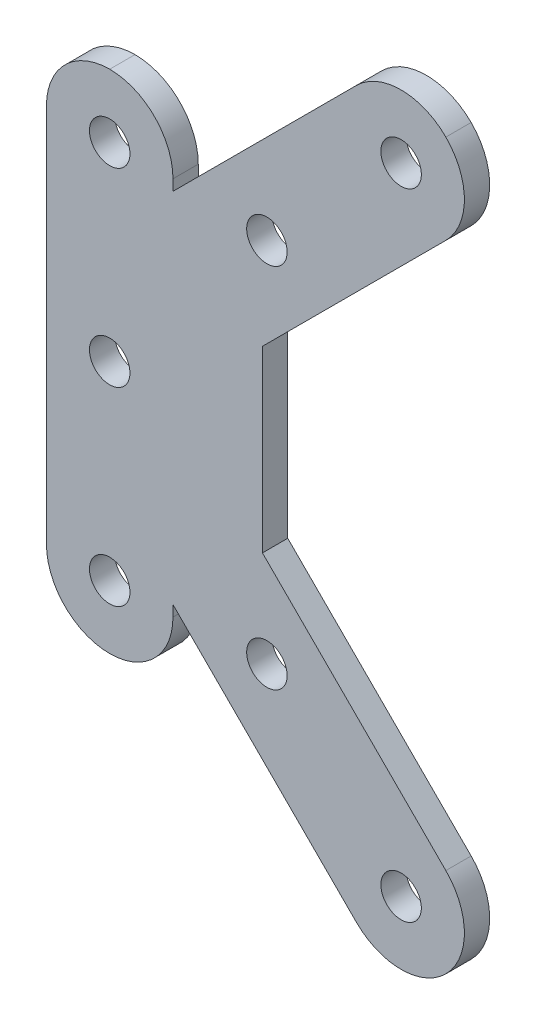
ISO-10303-21;
HEADER;
FILE_DESCRIPTION(('STEP AP214'),'2;1');
FILE_NAME('part.step','',(''),(''),'','','');
FILE_SCHEMA(('AUTOMOTIVE_DESIGN { 1 0 10303 214 1 1 1 1 }'));
ENDSEC;
DATA;
#1=APPLICATION_CONTEXT('core data for automotive mechanical design processes');
#2=APPLICATION_PROTOCOL_DEFINITION('international standard','automotive_design',2000,#1);
#3=PRODUCT_CONTEXT('',#1,'mechanical');
#4=PRODUCT('Part','Part','',(#3));
#5=PRODUCT_RELATED_PRODUCT_CATEGORY('part','',(#4));
#6=PRODUCT_DEFINITION_FORMATION('','',#4);
#7=PRODUCT_DEFINITION_CONTEXT('part definition',#1,'design');
#8=PRODUCT_DEFINITION('design','',#6,#7);
#9=PRODUCT_DEFINITION_SHAPE('','',#8);
#10=(LENGTH_UNIT() NAMED_UNIT(*) SI_UNIT(.MILLI.,.METRE.));
#11=(NAMED_UNIT(*) PLANE_ANGLE_UNIT() SI_UNIT($,.RADIAN.));
#12=(NAMED_UNIT(*) SI_UNIT($,.STERADIAN.) SOLID_ANGLE_UNIT());
#13=UNCERTAINTY_MEASURE_WITH_UNIT(LENGTH_MEASURE(1.E-05),#10,'distance_accuracy_value','');
#14=(GEOMETRIC_REPRESENTATION_CONTEXT(3) GLOBAL_UNCERTAINTY_ASSIGNED_CONTEXT((#13)) GLOBAL_UNIT_ASSIGNED_CONTEXT((#10,
#11,#12)) REPRESENTATION_CONTEXT('',''));
#15=CARTESIAN_POINT('',(0.,0.,0.));
#16=DIRECTION('',(0.,0.,1.));
#17=DIRECTION('',(1.,0.,0.));
#18=AXIS2_PLACEMENT_3D('',#15,#16,#17);
#19=CARTESIAN_POINT('',(0.,0.,1.));
#20=DIRECTION('',(0.,0.,1.));
#21=DIRECTION('',(1.,0.,0.));
#22=AXIS2_PLACEMENT_3D('',#19,#20,#21);
#23=PLANE('',#22);
#24=CARTESIAN_POINT('',(12.4246212024587,-14.4956890143242,1.));
#25=DIRECTION('',(0.,0.,-1.));
#26=DIRECTION('',(-1.,0.,0.));
#27=AXIS2_PLACEMENT_3D('',#24,#25,#26);
#28=CIRCLE('',#27,1.6);
#29=CARTESIAN_POINT('',(10.8246212024587,-14.4956890143242,1.));
#30=VERTEX_POINT('',#29);
#31=EDGE_CURVE('E730',#30,#30,#28,.T.);
#32=ORIENTED_EDGE('',*,*,#31,.T.);
#33=EDGE_LOOP('',(#32));
#34=FACE_BOUND('',#33,.T.);
#35=CARTESIAN_POINT('',(23.031222920257,25.1022907321224,1.));
#36=DIRECTION('',(0.,0.,1.));
#37=DIRECTION('',(1.,0.,0.));
#38=AXIS2_PLACEMENT_3D('',#35,#36,#37);
#39=CIRCLE('',#38,1.6);
#40=CARTESIAN_POINT('',(24.631222920257,25.1022907321224,1.));
#41=VERTEX_POINT('',#40);
#42=EDGE_CURVE('E715',#41,#41,#39,.T.);
#43=ORIENTED_EDGE('',*,*,#42,.F.);
#44=EDGE_LOOP('',(#43));
#45=FACE_BOUND('',#44,.T.);
#46=CARTESIAN_POINT('',(12.4246212024587,14.4956890143242,1.));
#47=DIRECTION('',(0.,0.,1.));
#48=DIRECTION('',(1.,0.,0.));
#49=AXIS2_PLACEMENT_3D('',#46,#47,#48);
#50=CIRCLE('',#49,1.6);
#51=CARTESIAN_POINT('',(14.0246212024587,14.4956890143242,1.));
#52=VERTEX_POINT('',#51);
#53=EDGE_CURVE('E711',#52,#52,#50,.T.);
#54=ORIENTED_EDGE('',*,*,#53,.F.);
#55=EDGE_LOOP('',(#54));
#56=FACE_BOUND('',#55,.T.);
#57=CARTESIAN_POINT('',(0.,-15.,1.));
#58=DIRECTION('',(0.,0.,1.));
#59=DIRECTION('',(1.,0.,0.));
#60=AXIS2_PLACEMENT_3D('',#57,#58,#59);
#61=CIRCLE('',#60,5.);
#62=CARTESIAN_POINT('',(-5.,-15.,1.));
#63=VERTEX_POINT('',#62);
#64=CARTESIAN_POINT('',(0.,-20.,1.));
#65=VERTEX_POINT('',#64);
#66=EDGE_CURVE('E327',#63,#65,#61,.T.);
#67=ORIENTED_EDGE('',*,*,#66,.T.);
#68=CARTESIAN_POINT('',(0.,-15.,1.));
#69=DIRECTION('',(0.,0.,1.));
#70=DIRECTION('',(1.,0.,0.));
#71=AXIS2_PLACEMENT_3D('',#68,#69,#70);
#72=CIRCLE('',#71,5.);
#73=CARTESIAN_POINT('',(5.,-15.,1.));
#74=VERTEX_POINT('',#73);
#75=EDGE_CURVE('E330',#65,#74,#72,.T.);
#76=ORIENTED_EDGE('',*,*,#75,.T.);
#77=DIRECTION('',(0.,1.,0.));
#78=VECTOR('',#77,1.);
#79=CARTESIAN_POINT('',(5.,-20.,1.));
#80=LINE('',#79,#78);
#81=CARTESIAN_POINT('',(5.,-14.1421356237309,1.));
#82=VERTEX_POINT('',#81);
#83=EDGE_CURVE('E264',#74,#82,#80,.T.);
#84=ORIENTED_EDGE('',*,*,#83,.T.);
#85=DIRECTION('',(-0.707106781186556,0.707106781186539,0.));
#86=VECTOR('',#85,1.);
#87=CARTESIAN_POINT('',(-4.57106781186554,-4.57106781186564,1.));
#88=LINE('',#87,#86);
#89=CARTESIAN_POINT('',(19.4956890143244,-28.637824638055,1.));
#90=VERTEX_POINT('',#89);
#91=EDGE_CURVE('E246',#90,#82,#88,.T.);
#92=ORIENTED_EDGE('',*,*,#91,.F.);
#93=CARTESIAN_POINT('',(23.0312229202571,-25.1022907321222,1.));
#94=DIRECTION('',(0.,0.,1.));
#95=DIRECTION('',(1.,0.,0.));
#96=AXIS2_PLACEMENT_3D('',#93,#94,#95);
#97=CIRCLE('',#96,5.);
#98=CARTESIAN_POINT('',(26.5667568261899,-28.6378246380549,1.));
#99=VERTEX_POINT('',#98);
#100=EDGE_CURVE('E324',#90,#99,#97,.T.);
#101=ORIENTED_EDGE('',*,*,#100,.T.);
#102=CARTESIAN_POINT('',(23.0312229202571,-25.1022907321222,1.));
#103=DIRECTION('',(0.,0.,1.));
#104=DIRECTION('',(1.,0.,0.));
#105=AXIS2_PLACEMENT_3D('',#102,#103,#104);
#106=CIRCLE('',#105,5.);
#107=CARTESIAN_POINT('',(26.5667568261898,-21.5667568261895,1.));
#108=VERTEX_POINT('',#107);
#109=EDGE_CURVE('E321',#99,#108,#106,.T.);
#110=ORIENTED_EDGE('',*,*,#109,.T.);
#111=DIRECTION('',(0.707106781186554,-0.707106781186542,0.));
#112=VECTOR('',#111,1.);
#113=CARTESIAN_POINT('',(2.49999999999996,2.5,1.));
#114=LINE('',#113,#112);
#115=CARTESIAN_POINT('',(12.0710678118654,-7.07106781186533,1.));
#116=VERTEX_POINT('',#115);
#117=EDGE_CURVE('E704',#116,#108,#114,.T.);
#118=ORIENTED_EDGE('',*,*,#117,.F.);
#119=DIRECTION('',(0.,-1.,0.));
#120=VECTOR('',#119,1.);
#121=CARTESIAN_POINT('',(12.0710678118655,0.,1.));
#122=LINE('',#121,#120);
#123=CARTESIAN_POINT('',(12.0710678118655,7.07106781186543,1.));
#124=VERTEX_POINT('',#123);
#125=EDGE_CURVE('E700',#124,#116,#122,.T.);
#126=ORIENTED_EDGE('',*,*,#125,.F.);
#127=DIRECTION('',(0.707106781186553,0.707106781186542,0.));
#128=VECTOR('',#127,1.);
#129=CARTESIAN_POINT('',(2.49999999999996,-2.5,1.));
#130=LINE('',#129,#128);
#131=CARTESIAN_POINT('',(26.5667568261898,21.5667568261895,1.));
#132=VERTEX_POINT('',#131);
#133=EDGE_CURVE('E684',#124,#132,#130,.T.);
#134=ORIENTED_EDGE('',*,*,#133,.T.);
#135=CARTESIAN_POINT('',(23.0312229202571,25.1022907321222,1.));
#136=DIRECTION('',(0.,0.,1.));
#137=DIRECTION('',(1.,0.,0.));
#138=AXIS2_PLACEMENT_3D('',#135,#136,#137);
#139=CIRCLE('',#138,5.);
#140=CARTESIAN_POINT('',(26.5667568261898,28.6378246380549,1.));
#141=VERTEX_POINT('',#140);
#142=EDGE_CURVE('E140',#132,#141,#139,.T.);
#143=ORIENTED_EDGE('',*,*,#142,.T.);
#144=CARTESIAN_POINT('',(23.0312229202571,25.1022907321222,1.));
#145=DIRECTION('',(0.,0.,1.));
#146=DIRECTION('',(1.,0.,0.));
#147=AXIS2_PLACEMENT_3D('',#144,#145,#146);
#148=CIRCLE('',#147,5.);
#149=CARTESIAN_POINT('',(19.4956890143244,28.637824638055,1.));
#150=VERTEX_POINT('',#149);
#151=EDGE_CURVE('E242',#141,#150,#148,.T.);
#152=ORIENTED_EDGE('',*,*,#151,.T.);
#153=DIRECTION('',(-0.707106781186555,-0.70710678118654,0.));
#154=VECTOR('',#153,1.);
#155=CARTESIAN_POINT('',(-4.57106781186552,4.57106781186561,1.));
#156=LINE('',#155,#154);
#157=CARTESIAN_POINT('',(5.,14.1421356237309,1.));
#158=VERTEX_POINT('',#157);
#159=EDGE_CURVE('E237',#150,#158,#156,.T.);
#160=ORIENTED_EDGE('',*,*,#159,.T.);
#161=CARTESIAN_POINT('',(5.,15.,1.));
#162=VERTEX_POINT('',#161);
#163=EDGE_CURVE('E241',#158,#162,#80,.T.);
#164=ORIENTED_EDGE('',*,*,#163,.T.);
#165=CARTESIAN_POINT('',(0.,15.,1.));
#166=DIRECTION('',(0.,0.,1.));
#167=DIRECTION('',(1.,0.,0.));
#168=AXIS2_PLACEMENT_3D('',#165,#166,#167);
#169=CIRCLE('',#168,5.);
#170=CARTESIAN_POINT('',(0.,20.,1.));
#171=VERTEX_POINT('',#170);
#172=EDGE_CURVE('E314',#162,#171,#169,.T.);
#173=ORIENTED_EDGE('',*,*,#172,.T.);
#174=CARTESIAN_POINT('',(0.,15.,1.));
#175=DIRECTION('',(0.,0.,1.));
#176=DIRECTION('',(1.,0.,0.));
#177=AXIS2_PLACEMENT_3D('',#174,#175,#176);
#178=CIRCLE('',#177,5.);
#179=CARTESIAN_POINT('',(-5.,15.,1.));
#180=VERTEX_POINT('',#179);
#181=EDGE_CURVE('E311',#171,#180,#178,.T.);
#182=ORIENTED_EDGE('',*,*,#181,.T.);
#183=DIRECTION('',(0.,-1.,0.));
#184=VECTOR('',#183,1.);
#185=CARTESIAN_POINT('',(-5.,20.,1.));
#186=LINE('',#185,#184);
#187=EDGE_CURVE('E265',#180,#63,#186,.T.);
#188=ORIENTED_EDGE('',*,*,#187,.T.);
#189=EDGE_LOOP('',(#67,#76,#84,#92,#101,#110,#118,#126,#134,#143,#152,#160,#164,#173,#182,#188));
#190=FACE_BOUND('',#189,.T.);
#191=CARTESIAN_POINT('',(0.,0.,1.));
#192=DIRECTION('',(0.,0.,1.));
#193=DIRECTION('',(1.,0.,0.));
#194=AXIS2_PLACEMENT_3D('',#191,#192,#193);
#195=CIRCLE('',#194,1.6);
#196=CARTESIAN_POINT('',(1.6,0.,1.));
#197=VERTEX_POINT('',#196);
#198=EDGE_CURVE('E420',#197,#197,#195,.T.);
#199=ORIENTED_EDGE('',*,*,#198,.F.);
#200=EDGE_LOOP('',(#199));
#201=FACE_BOUND('',#200,.T.);
#202=CARTESIAN_POINT('',(0.,15.,1.));
#203=DIRECTION('',(0.,0.,1.));
#204=DIRECTION('',(1.,0.,0.));
#205=AXIS2_PLACEMENT_3D('',#202,#203,#204);
#206=CIRCLE('',#205,1.6);
#207=CARTESIAN_POINT('',(1.59999999999995,15.,1.));
#208=VERTEX_POINT('',#207);
#209=EDGE_CURVE('E280',#208,#208,#206,.T.);
#210=ORIENTED_EDGE('',*,*,#209,.F.);
#211=EDGE_LOOP('',(#210));
#212=FACE_BOUND('',#211,.T.);
#213=CARTESIAN_POINT('',(1.5619817514858E-13,-15.,1.));
#214=DIRECTION('',(0.,0.,1.));
#215=DIRECTION('',(1.,0.,0.));
#216=AXIS2_PLACEMENT_3D('',#213,#214,#215);
#217=CIRCLE('',#216,1.6);
#218=CARTESIAN_POINT('',(1.60000000000016,-15.,1.));
#219=VERTEX_POINT('',#218);
#220=EDGE_CURVE('E410',#219,#219,#217,.T.);
#221=ORIENTED_EDGE('',*,*,#220,.F.);
#222=EDGE_LOOP('',(#221));
#223=FACE_BOUND('',#222,.T.);
#224=CARTESIAN_POINT('',(23.031222920257,-25.1022907321224,1.));
#225=DIRECTION('',(0.,0.,-1.));
#226=DIRECTION('',(-1.,0.,0.));
#227=AXIS2_PLACEMENT_3D('',#224,#225,#226);
#228=CIRCLE('',#227,1.6);
#229=CARTESIAN_POINT('',(21.4312229202569,-25.1022907321224,1.));
#230=VERTEX_POINT('',#229);
#231=EDGE_CURVE('E722',#230,#230,#228,.T.);
#232=ORIENTED_EDGE('',*,*,#231,.T.);
#233=EDGE_LOOP('',(#232));
#234=FACE_BOUND('',#233,.T.);
#235=ADVANCED_FACE('F122',(#34,#45,#56,#190,#201,#212,#223,#234),#23,.T.);
#236=CARTESIAN_POINT('',(0.,0.,-1.));
#237=DIRECTION('',(0.,0.,1.));
#238=DIRECTION('',(1.,0.,0.));
#239=AXIS2_PLACEMENT_3D('',#236,#237,#238);
#240=PLANE('',#239);
#241=CARTESIAN_POINT('',(23.031222920257,25.1022907321224,-1.));
#242=DIRECTION('',(0.,0.,1.));
#243=DIRECTION('',(1.,0.,0.));
#244=AXIS2_PLACEMENT_3D('',#241,#242,#243);
#245=CIRCLE('',#244,1.6);
#246=CARTESIAN_POINT('',(24.631222920257,25.1022907321224,-1.));
#247=VERTEX_POINT('',#246);
#248=EDGE_CURVE('E733',#247,#247,#245,.T.);
#249=ORIENTED_EDGE('',*,*,#248,.T.);
#250=EDGE_LOOP('',(#249));
#251=FACE_BOUND('',#250,.T.);
#252=CARTESIAN_POINT('',(12.4246212024587,14.4956890143242,-1.));
#253=DIRECTION('',(0.,0.,1.));
#254=DIRECTION('',(1.,0.,0.));
#255=AXIS2_PLACEMENT_3D('',#252,#253,#254);
#256=CIRCLE('',#255,1.6);
#257=CARTESIAN_POINT('',(14.0246212024587,14.4956890143242,-1.));
#258=VERTEX_POINT('',#257);
#259=EDGE_CURVE('E419',#258,#258,#256,.T.);
#260=ORIENTED_EDGE('',*,*,#259,.T.);
#261=EDGE_LOOP('',(#260));
#262=FACE_BOUND('',#261,.T.);
#263=DIRECTION('',(0.,1.,0.));
#264=VECTOR('',#263,1.);
#265=CARTESIAN_POINT('',(5.,-20.,-1.));
#266=LINE('',#265,#264);
#267=CARTESIAN_POINT('',(5.,-15.,-1.));
#268=VERTEX_POINT('',#267);
#269=CARTESIAN_POINT('',(5.,-14.1421356237309,-1.));
#270=VERTEX_POINT('',#269);
#271=EDGE_CURVE('E271',#268,#270,#266,.T.);
#272=ORIENTED_EDGE('',*,*,#271,.F.);
#273=CARTESIAN_POINT('',(0.,-15.,-1.));
#274=DIRECTION('',(0.,0.,1.));
#275=DIRECTION('',(1.,0.,0.));
#276=AXIS2_PLACEMENT_3D('',#273,#274,#275);
#277=CIRCLE('',#276,5.);
#278=CARTESIAN_POINT('',(0.,-20.,-1.));
#279=VERTEX_POINT('',#278);
#280=EDGE_CURVE('E308',#268,#279,#277,.F.);
#281=ORIENTED_EDGE('',*,*,#280,.T.);
#282=CARTESIAN_POINT('',(0.,-15.,-1.));
#283=DIRECTION('',(0.,0.,1.));
#284=DIRECTION('',(1.,0.,0.));
#285=AXIS2_PLACEMENT_3D('',#282,#283,#284);
#286=CIRCLE('',#285,5.);
#287=CARTESIAN_POINT('',(-5.,-15.,-1.));
#288=VERTEX_POINT('',#287);
#289=EDGE_CURVE('E305',#279,#288,#286,.F.);
#290=ORIENTED_EDGE('',*,*,#289,.T.);
#291=DIRECTION('',(0.,-1.,0.));
#292=VECTOR('',#291,1.);
#293=CARTESIAN_POINT('',(-5.,20.,-1.));
#294=LINE('',#293,#292);
#295=CARTESIAN_POINT('',(-5.,15.,-1.));
#296=VERTEX_POINT('',#295);
#297=EDGE_CURVE('E275',#296,#288,#294,.T.);
#298=ORIENTED_EDGE('',*,*,#297,.F.);
#299=CARTESIAN_POINT('',(0.,15.,-1.));
#300=DIRECTION('',(0.,0.,1.));
#301=DIRECTION('',(1.,0.,0.));
#302=AXIS2_PLACEMENT_3D('',#299,#300,#301);
#303=CIRCLE('',#302,5.);
#304=CARTESIAN_POINT('',(0.,20.,-1.));
#305=VERTEX_POINT('',#304);
#306=EDGE_CURVE('E287',#296,#305,#303,.F.);
#307=ORIENTED_EDGE('',*,*,#306,.T.);
#308=CARTESIAN_POINT('',(0.,15.,-1.));
#309=DIRECTION('',(0.,0.,1.));
#310=DIRECTION('',(1.,0.,0.));
#311=AXIS2_PLACEMENT_3D('',#308,#309,#310);
#312=CIRCLE('',#311,5.);
#313=CARTESIAN_POINT('',(5.,15.,-1.));
#314=VERTEX_POINT('',#313);
#315=EDGE_CURVE('E290',#305,#314,#312,.F.);
#316=ORIENTED_EDGE('',*,*,#315,.T.);
#317=CARTESIAN_POINT('',(5.,14.1421356237309,-1.));
#318=VERTEX_POINT('',#317);
#319=EDGE_CURVE('E279',#318,#314,#266,.T.);
#320=ORIENTED_EDGE('',*,*,#319,.F.);
#321=DIRECTION('',(-0.707106781186555,-0.70710678118654,0.));
#322=VECTOR('',#321,1.);
#323=CARTESIAN_POINT('',(-4.57106781186552,4.57106781186561,-1.));
#324=LINE('',#323,#322);
#325=CARTESIAN_POINT('',(19.4956890143244,28.637824638055,-1.));
#326=VERTEX_POINT('',#325);
#327=EDGE_CURVE('E253',#326,#318,#324,.T.);
#328=ORIENTED_EDGE('',*,*,#327,.F.);
#329=CARTESIAN_POINT('',(23.0312229202571,25.1022907321222,-1.));
#330=DIRECTION('',(0.,0.,1.));
#331=DIRECTION('',(1.,0.,0.));
#332=AXIS2_PLACEMENT_3D('',#329,#330,#331);
#333=CIRCLE('',#332,5.);
#334=CARTESIAN_POINT('',(26.5667568261898,28.6378246380549,-1.));
#335=VERTEX_POINT('',#334);
#336=EDGE_CURVE('E293',#326,#335,#333,.F.);
#337=ORIENTED_EDGE('',*,*,#336,.T.);
#338=CARTESIAN_POINT('',(23.0312229202571,25.1022907321222,-1.));
#339=DIRECTION('',(0.,0.,1.));
#340=DIRECTION('',(1.,0.,0.));
#341=AXIS2_PLACEMENT_3D('',#338,#339,#340);
#342=CIRCLE('',#341,5.);
#343=CARTESIAN_POINT('',(26.5667568261898,21.5667568261895,-1.));
#344=VERTEX_POINT('',#343);
#345=EDGE_CURVE('E296',#335,#344,#342,.F.);
#346=ORIENTED_EDGE('',*,*,#345,.T.);
#347=DIRECTION('',(0.707106781186553,0.707106781186542,0.));
#348=VECTOR('',#347,1.);
#349=CARTESIAN_POINT('',(2.49999999999996,-2.5,-1.));
#350=LINE('',#349,#348);
#351=CARTESIAN_POINT('',(12.0710678118655,7.07106781186543,-1.));
#352=VERTEX_POINT('',#351);
#353=EDGE_CURVE('E247',#352,#344,#350,.T.);
#354=ORIENTED_EDGE('',*,*,#353,.F.);
#355=DIRECTION('',(0.,-1.,0.));
#356=VECTOR('',#355,1.);
#357=CARTESIAN_POINT('',(12.0710678118655,0.,-1.));
#358=LINE('',#357,#356);
#359=CARTESIAN_POINT('',(12.0710678118654,-7.07106781186533,-1.));
#360=VERTEX_POINT('',#359);
#361=EDGE_CURVE('E690',#352,#360,#358,.T.);
#362=ORIENTED_EDGE('',*,*,#361,.T.);
#363=DIRECTION('',(0.707106781186554,-0.707106781186542,0.));
#364=VECTOR('',#363,1.);
#365=CARTESIAN_POINT('',(2.49999999999996,2.5,-1.));
#366=LINE('',#365,#364);
#367=CARTESIAN_POINT('',(26.5667568261898,-21.5667568261895,-1.));
#368=VERTEX_POINT('',#367);
#369=EDGE_CURVE('E681',#360,#368,#366,.T.);
#370=ORIENTED_EDGE('',*,*,#369,.T.);
#371=CARTESIAN_POINT('',(23.0312229202571,-25.1022907321222,-1.));
#372=DIRECTION('',(0.,0.,1.));
#373=DIRECTION('',(1.,0.,0.));
#374=AXIS2_PLACEMENT_3D('',#371,#372,#373);
#375=CIRCLE('',#374,5.);
#376=CARTESIAN_POINT('',(26.5667568261899,-28.6378246380549,-1.));
#377=VERTEX_POINT('',#376);
#378=EDGE_CURVE('E299',#368,#377,#375,.F.);
#379=ORIENTED_EDGE('',*,*,#378,.T.);
#380=CARTESIAN_POINT('',(23.0312229202571,-25.1022907321222,-1.));
#381=DIRECTION('',(0.,0.,1.));
#382=DIRECTION('',(1.,0.,0.));
#383=AXIS2_PLACEMENT_3D('',#380,#381,#382);
#384=CIRCLE('',#383,5.);
#385=CARTESIAN_POINT('',(19.4956890143244,-28.637824638055,-1.));
#386=VERTEX_POINT('',#385);
#387=EDGE_CURVE('E302',#377,#386,#384,.F.);
#388=ORIENTED_EDGE('',*,*,#387,.T.);
#389=DIRECTION('',(-0.707106781186556,0.707106781186539,0.));
#390=VECTOR('',#389,1.);
#391=CARTESIAN_POINT('',(-4.57106781186554,-4.57106781186564,-1.));
#392=LINE('',#391,#390);
#393=EDGE_CURVE('E398',#386,#270,#392,.T.);
#394=ORIENTED_EDGE('',*,*,#393,.T.);
#395=EDGE_LOOP('',(#272,#281,#290,#298,#307,#316,#320,#328,#337,#346,#354,#362,#370,#379,#388,#394));
#396=FACE_BOUND('',#395,.T.);
#397=CARTESIAN_POINT('',(0.,15.,-1.));
#398=DIRECTION('',(0.,0.,1.));
#399=DIRECTION('',(1.,0.,0.));
#400=AXIS2_PLACEMENT_3D('',#397,#398,#399);
#401=CIRCLE('',#400,1.6);
#402=CARTESIAN_POINT('',(1.59999999999995,15.,-1.));
#403=VERTEX_POINT('',#402);
#404=EDGE_CURVE('E424',#403,#403,#401,.T.);
#405=ORIENTED_EDGE('',*,*,#404,.T.);
#406=EDGE_LOOP('',(#405));
#407=FACE_BOUND('',#406,.T.);
#408=CARTESIAN_POINT('',(0.,0.,-1.));
#409=DIRECTION('',(0.,0.,1.));
#410=DIRECTION('',(1.,0.,0.));
#411=AXIS2_PLACEMENT_3D('',#408,#409,#410);
#412=CIRCLE('',#411,1.6);
#413=CARTESIAN_POINT('',(1.6,0.,-1.));
#414=VERTEX_POINT('',#413);
#415=EDGE_CURVE('E414',#414,#414,#412,.T.);
#416=ORIENTED_EDGE('',*,*,#415,.T.);
#417=EDGE_LOOP('',(#416));
#418=FACE_BOUND('',#417,.T.);
#419=CARTESIAN_POINT('',(1.5619817514858E-13,-15.,-1.));
#420=DIRECTION('',(0.,0.,1.));
#421=DIRECTION('',(1.,0.,0.));
#422=AXIS2_PLACEMENT_3D('',#419,#420,#421);
#423=CIRCLE('',#422,1.6);
#424=CARTESIAN_POINT('',(1.60000000000016,-15.,-1.));
#425=VERTEX_POINT('',#424);
#426=EDGE_CURVE('E415',#425,#425,#423,.T.);
#427=ORIENTED_EDGE('',*,*,#426,.T.);
#428=EDGE_LOOP('',(#427));
#429=FACE_BOUND('',#428,.T.);
#430=CARTESIAN_POINT('',(12.4246212024587,-14.4956890143242,-1.));
#431=DIRECTION('',(0.,0.,-1.));
#432=DIRECTION('',(-1.,0.,0.));
#433=AXIS2_PLACEMENT_3D('',#430,#431,#432);
#434=CIRCLE('',#433,1.6);
#435=CARTESIAN_POINT('',(10.8246212024587,-14.4956890143242,-1.));
#436=VERTEX_POINT('',#435);
#437=EDGE_CURVE('E726',#436,#436,#434,.T.);
#438=ORIENTED_EDGE('',*,*,#437,.F.);
#439=EDGE_LOOP('',(#438));
#440=FACE_BOUND('',#439,.T.);
#441=CARTESIAN_POINT('',(23.031222920257,-25.1022907321224,-1.));
#442=DIRECTION('',(0.,0.,-1.));
#443=DIRECTION('',(-1.,0.,0.));
#444=AXIS2_PLACEMENT_3D('',#441,#442,#443);
#445=CIRCLE('',#444,1.6);
#446=CARTESIAN_POINT('',(21.4312229202569,-25.1022907321224,-1.));
#447=VERTEX_POINT('',#446);
#448=EDGE_CURVE('E355',#447,#447,#445,.T.);
#449=ORIENTED_EDGE('',*,*,#448,.F.);
#450=EDGE_LOOP('',(#449));
#451=FACE_BOUND('',#450,.T.);
#452=ADVANCED_FACE('F395',(#251,#262,#396,#407,#418,#429,#440,#451),#240,.F.);
#453=CARTESIAN_POINT('',(-4.57106781186552,4.57106781186561,1.));
#454=DIRECTION('',(0.70710678118654,-0.707106781186555,0.));
#455=DIRECTION('',(0.707106781186555,0.70710678118654,0.));
#456=AXIS2_PLACEMENT_3D('',#453,#454,#455);
#457=PLANE('',#456);
#458=ORIENTED_EDGE('',*,*,#159,.F.);
#459=DIRECTION('',(0.,0.,-1.));
#460=VECTOR('',#459,1.);
#461=CARTESIAN_POINT('',(19.4956890143244,28.637824638055,1.));
#462=LINE('',#461,#460);
#463=EDGE_CURVE('E132',#150,#326,#462,.T.);
#464=ORIENTED_EDGE('',*,*,#463,.T.);
#465=ORIENTED_EDGE('',*,*,#327,.T.);
#466=DIRECTION('',(0.,0.,-1.));
#467=VECTOR('',#466,1.);
#468=CARTESIAN_POINT('',(5.,14.1421356237309,1.));
#469=LINE('',#468,#467);
#470=EDGE_CURVE('E250',#158,#318,#469,.T.);
#471=ORIENTED_EDGE('',*,*,#470,.F.);
#472=EDGE_LOOP('',(#458,#464,#465,#471));
#473=FACE_BOUND('',#472,.T.);
#474=ADVANCED_FACE('F251',(#473),#457,.F.);
#475=CARTESIAN_POINT('',(-4.57106781186554,-4.57106781186564,1.));
#476=DIRECTION('',(-0.707106781186539,-0.707106781186556,0.));
#477=DIRECTION('',(0.707106781186556,-0.707106781186539,0.));
#478=AXIS2_PLACEMENT_3D('',#475,#476,#477);
#479=PLANE('',#478);
#480=ORIENTED_EDGE('',*,*,#393,.F.);
#481=DIRECTION('',(0.,0.,-1.));
#482=VECTOR('',#481,1.);
#483=CARTESIAN_POINT('',(19.4956890143244,-28.637824638055,1.));
#484=LINE('',#483,#482);
#485=EDGE_CURVE('E339',#386,#90,#484,.F.);
#486=ORIENTED_EDGE('',*,*,#485,.T.);
#487=ORIENTED_EDGE('',*,*,#91,.T.);
#488=DIRECTION('',(0.,0.,-1.));
#489=VECTOR('',#488,1.);
#490=CARTESIAN_POINT('',(5.,-14.1421356237309,1.));
#491=LINE('',#490,#489);
#492=EDGE_CURVE('E259',#82,#270,#491,.T.);
#493=ORIENTED_EDGE('',*,*,#492,.T.);
#494=EDGE_LOOP('',(#480,#486,#487,#493));
#495=FACE_BOUND('',#494,.T.);
#496=ADVANCED_FACE('F400',(#495),#479,.T.);
#497=CARTESIAN_POINT('',(2.49999999999996,2.5,1.));
#498=DIRECTION('',(0.707106781186542,0.707106781186554,0.));
#499=DIRECTION('',(-0.707106781186554,0.707106781186542,0.));
#500=AXIS2_PLACEMENT_3D('',#497,#498,#499);
#501=PLANE('',#500);
#502=ORIENTED_EDGE('',*,*,#117,.T.);
#503=DIRECTION('',(0.,0.,-1.));
#504=VECTOR('',#503,1.);
#505=CARTESIAN_POINT('',(26.5667568261898,-21.5667568261895,1.));
#506=LINE('',#505,#504);
#507=EDGE_CURVE('E343',#108,#368,#506,.T.);
#508=ORIENTED_EDGE('',*,*,#507,.T.);
#509=ORIENTED_EDGE('',*,*,#369,.F.);
#510=DIRECTION('',(0.,0.,-1.));
#511=VECTOR('',#510,1.);
#512=CARTESIAN_POINT('',(12.0710678118654,-7.07106781186533,1.));
#513=LINE('',#512,#511);
#514=EDGE_CURVE('E403',#116,#360,#513,.T.);
#515=ORIENTED_EDGE('',*,*,#514,.F.);
#516=EDGE_LOOP('',(#502,#508,#509,#515));
#517=FACE_BOUND('',#516,.T.);
#518=ADVANCED_FACE('F474',(#517),#501,.T.);
#519=CARTESIAN_POINT('',(12.0710678118655,0.,1.));
#520=DIRECTION('',(1.,0.,0.));
#521=DIRECTION('',(0.,1.,0.));
#522=AXIS2_PLACEMENT_3D('',#519,#520,#521);
#523=PLANE('',#522);
#524=ORIENTED_EDGE('',*,*,#361,.F.);
#525=DIRECTION('',(0.,0.,-1.));
#526=VECTOR('',#525,1.);
#527=CARTESIAN_POINT('',(12.0710678118655,7.07106781186543,1.));
#528=LINE('',#527,#526);
#529=EDGE_CURVE('E406',#124,#352,#528,.T.);
#530=ORIENTED_EDGE('',*,*,#529,.F.);
#531=ORIENTED_EDGE('',*,*,#125,.T.);
#532=ORIENTED_EDGE('',*,*,#514,.T.);
#533=EDGE_LOOP('',(#524,#530,#531,#532));
#534=FACE_BOUND('',#533,.T.);
#535=ADVANCED_FACE('F470',(#534),#523,.T.);
#536=CARTESIAN_POINT('',(2.49999999999996,-2.5,1.));
#537=DIRECTION('',(-0.707106781186542,0.707106781186553,0.));
#538=DIRECTION('',(-0.707106781186553,-0.707106781186542,0.));
#539=AXIS2_PLACEMENT_3D('',#536,#537,#538);
#540=PLANE('',#539);
#541=ORIENTED_EDGE('',*,*,#353,.T.);
#542=DIRECTION('',(0.,0.,-1.));
#543=VECTOR('',#542,1.);
#544=CARTESIAN_POINT('',(26.5667568261898,21.5667568261895,1.));
#545=LINE('',#544,#543);
#546=EDGE_CURVE('E346',#344,#132,#545,.F.);
#547=ORIENTED_EDGE('',*,*,#546,.T.);
#548=ORIENTED_EDGE('',*,*,#133,.F.);
#549=ORIENTED_EDGE('',*,*,#529,.T.);
#550=EDGE_LOOP('',(#541,#547,#548,#549));
#551=FACE_BOUND('',#550,.T.);
#552=ADVANCED_FACE('F446',(#551),#540,.F.);
#553=CARTESIAN_POINT('',(1.5619817514858E-13,-15.,1.));
#554=DIRECTION('',(0.,0.,-1.));
#555=DIRECTION('',(-1.,0.,0.));
#556=AXIS2_PLACEMENT_3D('',#553,#554,#555);
#557=CYLINDRICAL_SURFACE('',#556,1.6);
#558=ORIENTED_EDGE('',*,*,#220,.T.);
#559=EDGE_LOOP('',(#558));
#560=FACE_BOUND('',#559,.T.);
#561=ORIENTED_EDGE('',*,*,#426,.F.);
#562=EDGE_LOOP('',(#561));
#563=FACE_BOUND('',#562,.T.);
#564=ADVANCED_FACE('F437',(#560,#563),#557,.F.);
#565=CARTESIAN_POINT('',(0.,15.,1.));
#566=DIRECTION('',(0.,0.,-1.));
#567=DIRECTION('',(-1.,0.,0.));
#568=AXIS2_PLACEMENT_3D('',#565,#566,#567);
#569=CYLINDRICAL_SURFACE('',#568,1.6);
#570=ORIENTED_EDGE('',*,*,#209,.T.);
#571=EDGE_LOOP('',(#570));
#572=FACE_BOUND('',#571,.T.);
#573=ORIENTED_EDGE('',*,*,#404,.F.);
#574=EDGE_LOOP('',(#573));
#575=FACE_BOUND('',#574,.T.);
#576=ADVANCED_FACE('F435',(#572,#575),#569,.F.);
#577=CARTESIAN_POINT('',(-5.,20.,1.));
#578=DIRECTION('',(1.,0.,0.));
#579=DIRECTION('',(0.,1.,0.));
#580=AXIS2_PLACEMENT_3D('',#577,#578,#579);
#581=PLANE('',#580);
#582=ORIENTED_EDGE('',*,*,#297,.T.);
#583=DIRECTION('',(0.,0.,-1.));
#584=VECTOR('',#583,1.);
#585=CARTESIAN_POINT('',(-5.,-15.,1.));
#586=LINE('',#585,#584);
#587=EDGE_CURVE('E336',#288,#63,#586,.F.);
#588=ORIENTED_EDGE('',*,*,#587,.T.);
#589=ORIENTED_EDGE('',*,*,#187,.F.);
#590=DIRECTION('',(0.,0.,-1.));
#591=VECTOR('',#590,1.);
#592=CARTESIAN_POINT('',(-5.,15.,1.));
#593=LINE('',#592,#591);
#594=EDGE_CURVE('E333',#180,#296,#593,.T.);
#595=ORIENTED_EDGE('',*,*,#594,.T.);
#596=EDGE_LOOP('',(#582,#588,#589,#595));
#597=FACE_BOUND('',#596,.T.);
#598=ADVANCED_FACE('F376',(#597),#581,.F.);
#599=CARTESIAN_POINT('',(0.,0.,1.));
#600=DIRECTION('',(0.,0.,-1.));
#601=DIRECTION('',(-1.,0.,0.));
#602=AXIS2_PLACEMENT_3D('',#599,#600,#601);
#603=CYLINDRICAL_SURFACE('',#602,1.6);
#604=ORIENTED_EDGE('',*,*,#198,.T.);
#605=EDGE_LOOP('',(#604));
#606=FACE_BOUND('',#605,.T.);
#607=ORIENTED_EDGE('',*,*,#415,.F.);
#608=EDGE_LOOP('',(#607));
#609=FACE_BOUND('',#608,.T.);
#610=ADVANCED_FACE('F440',(#606,#609),#603,.F.);
#611=CARTESIAN_POINT('',(5.,-20.,1.));
#612=DIRECTION('',(-1.,0.,0.));
#613=DIRECTION('',(0.,-1.,0.));
#614=AXIS2_PLACEMENT_3D('',#611,#612,#613);
#615=PLANE('',#614);
#616=ORIENTED_EDGE('',*,*,#319,.T.);
#617=DIRECTION('',(0.,0.,-1.));
#618=VECTOR('',#617,1.);
#619=CARTESIAN_POINT('',(5.,15.,1.));
#620=LINE('',#619,#618);
#621=EDGE_CURVE('E12',#314,#162,#620,.F.);
#622=ORIENTED_EDGE('',*,*,#621,.T.);
#623=ORIENTED_EDGE('',*,*,#163,.F.);
#624=ORIENTED_EDGE('',*,*,#470,.T.);
#625=EDGE_LOOP('',(#616,#622,#623,#624));
#626=FACE_BOUND('',#625,.T.);
#627=ADVANCED_FACE('F261',(#626),#615,.F.);
#628=ORIENTED_EDGE('',*,*,#83,.F.);
#629=DIRECTION('',(0.,0.,-1.));
#630=VECTOR('',#629,1.);
#631=CARTESIAN_POINT('',(5.,-15.,1.));
#632=LINE('',#631,#630);
#633=EDGE_CURVE('E258',#74,#268,#632,.T.);
#634=ORIENTED_EDGE('',*,*,#633,.T.);
#635=ORIENTED_EDGE('',*,*,#271,.T.);
#636=ORIENTED_EDGE('',*,*,#492,.F.);
#637=EDGE_LOOP('',(#628,#634,#635,#636));
#638=FACE_BOUND('',#637,.T.);
#639=ADVANCED_FACE('F390',(#638),#615,.F.);
#640=CARTESIAN_POINT('',(12.4246212024587,14.4956890143242,-1.));
#641=DIRECTION('',(0.,0.,1.));
#642=DIRECTION('',(1.,0.,0.));
#643=AXIS2_PLACEMENT_3D('',#640,#641,#642);
#644=CYLINDRICAL_SURFACE('',#643,1.6);
#645=ORIENTED_EDGE('',*,*,#259,.F.);
#646=EDGE_LOOP('',(#645));
#647=FACE_BOUND('',#646,.T.);
#648=ORIENTED_EDGE('',*,*,#53,.T.);
#649=EDGE_LOOP('',(#648));
#650=FACE_BOUND('',#649,.T.);
#651=ADVANCED_FACE('F454',(#647,#650),#644,.F.);
#652=CARTESIAN_POINT('',(23.031222920257,25.1022907321224,-1.));
#653=DIRECTION('',(0.,0.,1.));
#654=DIRECTION('',(1.,0.,0.));
#655=AXIS2_PLACEMENT_3D('',#652,#653,#654);
#656=CYLINDRICAL_SURFACE('',#655,1.6);
#657=ORIENTED_EDGE('',*,*,#248,.F.);
#658=EDGE_LOOP('',(#657));
#659=FACE_BOUND('',#658,.T.);
#660=ORIENTED_EDGE('',*,*,#42,.T.);
#661=EDGE_LOOP('',(#660));
#662=FACE_BOUND('',#661,.T.);
#663=ADVANCED_FACE('F529',(#659,#662),#656,.F.);
#664=CARTESIAN_POINT('',(12.4246212024587,-14.4956890143242,-1.));
#665=DIRECTION('',(0.,0.,1.));
#666=DIRECTION('',(1.,0.,0.));
#667=AXIS2_PLACEMENT_3D('',#664,#665,#666);
#668=CYLINDRICAL_SURFACE('',#667,1.6);
#669=ORIENTED_EDGE('',*,*,#437,.T.);
#670=EDGE_LOOP('',(#669));
#671=FACE_BOUND('',#670,.T.);
#672=ORIENTED_EDGE('',*,*,#31,.F.);
#673=EDGE_LOOP('',(#672));
#674=FACE_BOUND('',#673,.T.);
#675=ADVANCED_FACE('F539',(#671,#674),#668,.F.);
#676=CARTESIAN_POINT('',(23.031222920257,-25.1022907321224,-1.));
#677=DIRECTION('',(0.,0.,1.));
#678=DIRECTION('',(1.,0.,0.));
#679=AXIS2_PLACEMENT_3D('',#676,#677,#678);
#680=CYLINDRICAL_SURFACE('',#679,1.6);
#681=ORIENTED_EDGE('',*,*,#448,.T.);
#682=EDGE_LOOP('',(#681));
#683=FACE_BOUND('',#682,.T.);
#684=ORIENTED_EDGE('',*,*,#231,.F.);
#685=EDGE_LOOP('',(#684));
#686=FACE_BOUND('',#685,.T.);
#687=ADVANCED_FACE('F549',(#683,#686),#680,.F.);
#688=CARTESIAN_POINT('',(0.,-15.,1.));
#689=DIRECTION('',(0.,0.,-1.));
#690=DIRECTION('',(-1.,0.,0.));
#691=AXIS2_PLACEMENT_3D('',#688,#689,#690);
#692=CYLINDRICAL_SURFACE('',#691,5.);
#693=DIRECTION('',(0.,0.,-1.));
#694=VECTOR('',#693,1.);
#695=CARTESIAN_POINT('',(0.,-20.,1.));
#696=LINE('',#695,#694);
#697=EDGE_CURVE('E351',#65,#279,#696,.T.);
#698=ORIENTED_EDGE('',*,*,#697,.F.);
#699=ORIENTED_EDGE('',*,*,#66,.F.);
#700=ORIENTED_EDGE('',*,*,#587,.F.);
#701=ORIENTED_EDGE('',*,*,#289,.F.);
#702=EDGE_LOOP('',(#698,#699,#700,#701));
#703=FACE_BOUND('',#702,.T.);
#704=ADVANCED_FACE('F382',(#703),#692,.T.);
#705=CARTESIAN_POINT('',(0.,-15.,1.));
#706=DIRECTION('',(0.,0.,-1.));
#707=DIRECTION('',(-1.,0.,0.));
#708=AXIS2_PLACEMENT_3D('',#705,#706,#707);
#709=CYLINDRICAL_SURFACE('',#708,5.);
#710=ORIENTED_EDGE('',*,*,#75,.F.);
#711=ORIENTED_EDGE('',*,*,#697,.T.);
#712=ORIENTED_EDGE('',*,*,#280,.F.);
#713=ORIENTED_EDGE('',*,*,#633,.F.);
#714=EDGE_LOOP('',(#710,#711,#712,#713));
#715=FACE_BOUND('',#714,.T.);
#716=ADVANCED_FACE('F393',(#715),#709,.T.);
#717=CARTESIAN_POINT('',(23.0312229202571,-25.1022907321222,1.));
#718=DIRECTION('',(0.,0.,-1.));
#719=DIRECTION('',(-1.,0.,0.));
#720=AXIS2_PLACEMENT_3D('',#717,#718,#719);
#721=CYLINDRICAL_SURFACE('',#720,5.);
#722=ORIENTED_EDGE('',*,*,#507,.F.);
#723=ORIENTED_EDGE('',*,*,#109,.F.);
#724=DIRECTION('',(0.,0.,-1.));
#725=VECTOR('',#724,1.);
#726=CARTESIAN_POINT('',(26.5667568261899,-28.6378246380549,1.));
#727=LINE('',#726,#725);
#728=EDGE_CURVE('E356',#377,#99,#727,.F.);
#729=ORIENTED_EDGE('',*,*,#728,.F.);
#730=ORIENTED_EDGE('',*,*,#378,.F.);
#731=EDGE_LOOP('',(#722,#723,#729,#730));
#732=FACE_BOUND('',#731,.T.);
#733=ADVANCED_FACE('F614',(#732),#721,.T.);
#734=CARTESIAN_POINT('',(23.0312229202571,-25.1022907321222,1.));
#735=DIRECTION('',(0.,0.,-1.));
#736=DIRECTION('',(-1.,0.,0.));
#737=AXIS2_PLACEMENT_3D('',#734,#735,#736);
#738=CYLINDRICAL_SURFACE('',#737,5.);
#739=ORIENTED_EDGE('',*,*,#100,.F.);
#740=ORIENTED_EDGE('',*,*,#485,.F.);
#741=ORIENTED_EDGE('',*,*,#387,.F.);
#742=ORIENTED_EDGE('',*,*,#728,.T.);
#743=EDGE_LOOP('',(#739,#740,#741,#742));
#744=FACE_BOUND('',#743,.T.);
#745=ADVANCED_FACE('F616',(#744),#738,.T.);
#746=CARTESIAN_POINT('',(23.0312229202571,25.1022907321222,1.));
#747=DIRECTION('',(0.,0.,-1.));
#748=DIRECTION('',(-1.,0.,0.));
#749=AXIS2_PLACEMENT_3D('',#746,#747,#748);
#750=CYLINDRICAL_SURFACE('',#749,5.);
#751=ORIENTED_EDGE('',*,*,#463,.F.);
#752=ORIENTED_EDGE('',*,*,#151,.F.);
#753=DIRECTION('',(0.,0.,-1.));
#754=VECTOR('',#753,1.);
#755=CARTESIAN_POINT('',(26.5667568261898,28.6378246380549,1.));
#756=LINE('',#755,#754);
#757=EDGE_CURVE('E359',#335,#141,#756,.F.);
#758=ORIENTED_EDGE('',*,*,#757,.F.);
#759=ORIENTED_EDGE('',*,*,#336,.F.);
#760=EDGE_LOOP('',(#751,#752,#758,#759));
#761=FACE_BOUND('',#760,.T.);
#762=ADVANCED_FACE('F619',(#761),#750,.T.);
#763=CARTESIAN_POINT('',(23.0312229202571,25.1022907321222,1.));
#764=DIRECTION('',(0.,0.,-1.));
#765=DIRECTION('',(-1.,0.,0.));
#766=AXIS2_PLACEMENT_3D('',#763,#764,#765);
#767=CYLINDRICAL_SURFACE('',#766,5.);
#768=ORIENTED_EDGE('',*,*,#142,.F.);
#769=ORIENTED_EDGE('',*,*,#546,.F.);
#770=ORIENTED_EDGE('',*,*,#345,.F.);
#771=ORIENTED_EDGE('',*,*,#757,.T.);
#772=EDGE_LOOP('',(#768,#769,#770,#771));
#773=FACE_BOUND('',#772,.T.);
#774=ADVANCED_FACE('F624',(#773),#767,.T.);
#775=CARTESIAN_POINT('',(0.,15.,1.));
#776=DIRECTION('',(0.,0.,-1.));
#777=DIRECTION('',(-1.,0.,0.));
#778=AXIS2_PLACEMENT_3D('',#775,#776,#777);
#779=CYLINDRICAL_SURFACE('',#778,5.);
#780=ORIENTED_EDGE('',*,*,#594,.F.);
#781=ORIENTED_EDGE('',*,*,#181,.F.);
#782=DIRECTION('',(0.,0.,-1.));
#783=VECTOR('',#782,1.);
#784=CARTESIAN_POINT('',(0.,20.,1.));
#785=LINE('',#784,#783);
#786=EDGE_CURVE('E126',#305,#171,#785,.F.);
#787=ORIENTED_EDGE('',*,*,#786,.F.);
#788=ORIENTED_EDGE('',*,*,#306,.F.);
#789=EDGE_LOOP('',(#780,#781,#787,#788));
#790=FACE_BOUND('',#789,.T.);
#791=ADVANCED_FACE('F124',(#790),#779,.T.);
#792=CARTESIAN_POINT('',(0.,15.,1.));
#793=DIRECTION('',(0.,0.,-1.));
#794=DIRECTION('',(-1.,0.,0.));
#795=AXIS2_PLACEMENT_3D('',#792,#793,#794);
#796=CYLINDRICAL_SURFACE('',#795,5.);
#797=ORIENTED_EDGE('',*,*,#172,.F.);
#798=ORIENTED_EDGE('',*,*,#621,.F.);
#799=ORIENTED_EDGE('',*,*,#315,.F.);
#800=ORIENTED_EDGE('',*,*,#786,.T.);
#801=EDGE_LOOP('',(#797,#798,#799,#800));
#802=FACE_BOUND('',#801,.T.);
#803=ADVANCED_FACE('F368',(#802),#796,.T.);
#804=CLOSED_SHELL('',(#235,#452,#474,#496,#518,#535,#552,#564,#576,#598,#610,#627,#639,#651,
#663,#675,#687,#704,#716,#733,#745,#762,#774,#791,#803));
#805=MANIFOLD_SOLID_BREP('B2',#804);
#806=ADVANCED_BREP_SHAPE_REPRESENTATION('',(#18,#805),#14);
#807=SHAPE_DEFINITION_REPRESENTATION(#9,#806);
ENDSEC;
END-ISO-10303-21;
